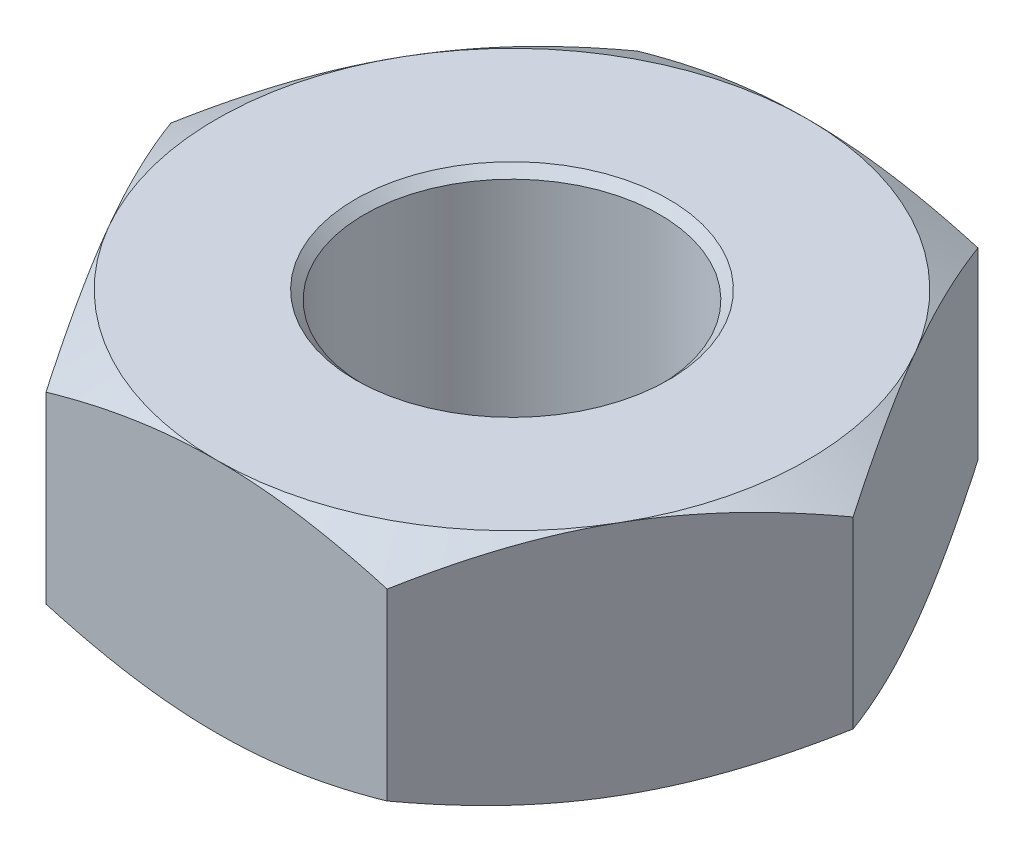
ISO-10303-21;
HEADER;
FILE_DESCRIPTION(('STEP AP214'),'2;1');
FILE_NAME('part.step','',(''),(''),'','','');
FILE_SCHEMA(('AUTOMOTIVE_DESIGN { 1 0 10303 214 1 1 1 1 }'));
ENDSEC;
DATA;
#1=APPLICATION_CONTEXT('core data for automotive mechanical design processes');
#2=APPLICATION_PROTOCOL_DEFINITION('international standard','automotive_design',2000,#1);
#3=PRODUCT_CONTEXT('',#1,'mechanical');
#4=PRODUCT('Part','Part','',(#3));
#5=PRODUCT_RELATED_PRODUCT_CATEGORY('part','',(#4));
#6=PRODUCT_DEFINITION_FORMATION('','',#4);
#7=PRODUCT_DEFINITION_CONTEXT('part definition',#1,'design');
#8=PRODUCT_DEFINITION('design','',#6,#7);
#9=PRODUCT_DEFINITION_SHAPE('','',#8);
#10=(LENGTH_UNIT() NAMED_UNIT(*) SI_UNIT(.MILLI.,.METRE.));
#11=(NAMED_UNIT(*) PLANE_ANGLE_UNIT() SI_UNIT($,.RADIAN.));
#12=(NAMED_UNIT(*) SI_UNIT($,.STERADIAN.) SOLID_ANGLE_UNIT());
#13=UNCERTAINTY_MEASURE_WITH_UNIT(LENGTH_MEASURE(1.E-05),#10,'distance_accuracy_value','');
#14=(GEOMETRIC_REPRESENTATION_CONTEXT(3) GLOBAL_UNCERTAINTY_ASSIGNED_CONTEXT((#13)) GLOBAL_UNIT_ASSIGNED_CONTEXT((#10,
#11,#12)) REPRESENTATION_CONTEXT('',''));
#15=CARTESIAN_POINT('',(0.,0.,0.));
#16=DIRECTION('',(0.,0.,1.));
#17=DIRECTION('',(1.,0.,0.));
#18=AXIS2_PLACEMENT_3D('',#15,#16,#17);
#19=CARTESIAN_POINT('',(0.,2.,0.));
#20=DIRECTION('',(0.,1.,0.));
#21=DIRECTION('',(0.,0.,1.));
#22=AXIS2_PLACEMENT_3D('',#19,#20,#21);
#23=PLANE('',#22);
#24=CARTESIAN_POINT('',(0.,2.,0.));
#25=DIRECTION('',(0.,1.,0.));
#26=DIRECTION('',(0.,0.,1.));
#27=AXIS2_PLACEMENT_3D('',#24,#25,#26);
#28=CIRCLE('',#27,1.325);
#29=CARTESIAN_POINT('',(0.,2.,1.325));
#30=VERTEX_POINT('',#29);
#31=EDGE_CURVE('E12',#30,#30,#28,.F.);
#32=ORIENTED_EDGE('',*,*,#31,.T.);
#33=EDGE_LOOP('',(#32));
#34=FACE_BOUND('',#33,.T.);
#35=CARTESIAN_POINT('',(0.,2.,0.));
#36=DIRECTION('',(0.,1.,0.));
#37=DIRECTION('',(0.,0.,1.));
#38=AXIS2_PLACEMENT_3D('',#35,#36,#37);
#39=CIRCLE('',#38,2.5);
#40=CARTESIAN_POINT('',(-2.1650635094611,2.,1.25));
#41=VERTEX_POINT('',#40);
#42=CARTESIAN_POINT('',(0.,2.,2.5));
#43=VERTEX_POINT('',#42);
#44=EDGE_CURVE('E158',#41,#43,#39,.T.);
#45=ORIENTED_EDGE('',*,*,#44,.T.);
#46=CARTESIAN_POINT('',(2.1650635094611,2.,1.25));
#47=VERTEX_POINT('',#46);
#48=EDGE_CURVE('E139',#43,#47,#39,.T.);
#49=ORIENTED_EDGE('',*,*,#48,.T.);
#50=CARTESIAN_POINT('',(2.1650635094611,2.,-1.25));
#51=VERTEX_POINT('',#50);
#52=EDGE_CURVE('E129',#47,#51,#39,.T.);
#53=ORIENTED_EDGE('',*,*,#52,.T.);
#54=CARTESIAN_POINT('',(0.,2.,-2.5));
#55=VERTEX_POINT('',#54);
#56=EDGE_CURVE('E55',#51,#55,#39,.T.);
#57=ORIENTED_EDGE('',*,*,#56,.T.);
#58=CARTESIAN_POINT('',(-2.1650635094611,2.,-1.25));
#59=VERTEX_POINT('',#58);
#60=EDGE_CURVE('E63',#55,#59,#39,.T.);
#61=ORIENTED_EDGE('',*,*,#60,.T.);
#62=EDGE_CURVE('E162',#59,#41,#39,.T.);
#63=ORIENTED_EDGE('',*,*,#62,.T.);
#64=EDGE_LOOP('',(#45,#49,#53,#57,#61,#63));
#65=FACE_BOUND('',#64,.T.);
#66=ADVANCED_FACE('F39',(#34,#65),#23,.T.);
#67=CARTESIAN_POINT('',(1.44337567297406,2.,2.5));
#68=DIRECTION('',(-0.866025403784439,0.,-0.5));
#69=DIRECTION('',(-0.5,0.,0.866025403784439));
#70=AXIS2_PLACEMENT_3D('',#67,#68,#69);
#71=PLANE('',#70);
#72=CARTESIAN_POINT('',(1.44326020292023,1.77664233564089,2.5002));
#73=CARTESIAN_POINT('',(1.50668977106845,1.81327837989237,2.39033676526513));
#74=CARTESIAN_POINT('',(1.57066685804385,1.84659778103494,2.27952520010348));
#75=CARTESIAN_POINT('',(1.69972891130041,1.90475771444214,2.05598316653395));
#76=CARTESIAN_POINT('',(1.7648161711947,1.92957767085226,1.94324872547161));
#77=CARTESIAN_POINT('',(1.8941840386774,1.96821434855895,1.71917700612473));
#78=CARTESIAN_POINT('',(1.95844473900197,1.98228820381436,1.60787420823262));
#79=CARTESIAN_POINT('',(2.08726857876804,1.99909084764725,1.38474477253167));
#80=CARTESIAN_POINT('',(2.15183124982667,2.00183354879637,1.27291894598577));
#81=CARTESIAN_POINT('',(2.27247489412634,1.99613423999195,1.06395802444848));
#82=CARTESIAN_POINT('',(2.32857390783979,1.98909160561814,0.96679168244227));
#83=CARTESIAN_POINT('',(2.44040644260542,1.96676858087506,0.773092050288998));
#84=CARTESIAN_POINT('',(2.49613957671839,1.95148056155973,0.676559430340268));
#85=CARTESIAN_POINT('',(2.60820277442169,1.91326090615558,0.482460278259524));
#86=CARTESIAN_POINT('',(2.66451865130903,1.89016722387448,0.38491831821786));
#87=CARTESIAN_POINT('',(2.77631036402774,1.83775334342209,0.191289391923915));
#88=CARTESIAN_POINT('',(2.83178763258718,1.80844546437545,0.0951999441138239));
#89=CARTESIAN_POINT('',(2.88686681600197,1.77664233564089,-0.000200000000000342));
#90=B_SPLINE_CURVE_WITH_KNOTS('',3,(#72,#73,#74,#75,#76,#77,#78,#79,#80,#81,#82,#83,#84,#85,#86,
#87,#88,#89),.UNSPECIFIED.,.F.,.F.,(4,2,2,2,2,2,2,2,4),(0.,0.396285827362227,0.793524330152051,
1.18093086852114,1.56786160134475,1.90479741793733,2.24204551660463,2.58677531536756,
2.93082800105257),.UNSPECIFIED.);
#91=CARTESIAN_POINT('',(1.44337567297407,1.7767090063074,2.5));
#92=VERTEX_POINT('',#91);
#93=EDGE_CURVE('E144',#92,#47,#90,.T.);
#94=ORIENTED_EDGE('',*,*,#93,.F.);
#95=DIRECTION('',(0.,-1.,0.));
#96=VECTOR('',#95,1.);
#97=CARTESIAN_POINT('',(1.44337567297406,2.,2.5));
#98=LINE('',#97,#96);
#99=CARTESIAN_POINT('',(1.44337567297406,0.223290993692602,2.5));
#100=VERTEX_POINT('',#99);
#101=EDGE_CURVE('E355',#92,#100,#98,.T.);
#102=ORIENTED_EDGE('',*,*,#101,.T.);
#103=CARTESIAN_POINT('',(1.44326020292023,0.223357664359108,2.5002));
#104=CARTESIAN_POINT('',(1.50668977106845,0.186721620107626,2.39033676526513));
#105=CARTESIAN_POINT('',(1.57066685804385,0.153402218965056,2.27952520010348));
#106=CARTESIAN_POINT('',(1.69972891130041,0.0952422855578578,2.05598316653395));
#107=CARTESIAN_POINT('',(1.7648161711947,0.0704223291477385,1.94324872547161));
#108=CARTESIAN_POINT('',(1.8941840386774,0.0317856514410522,1.71917700612473));
#109=CARTESIAN_POINT('',(1.95844473900197,0.017711796185639,1.60787420823262));
#110=CARTESIAN_POINT('',(2.08726857876804,0.000909152352750122,1.38474477253167));
#111=CARTESIAN_POINT('',(2.15183124982667,-0.00183354879637351,1.27291894598577));
#112=CARTESIAN_POINT('',(2.27247489412634,0.00386576000805331,1.06395802444848));
#113=CARTESIAN_POINT('',(2.32857390783979,0.0109083943818614,0.96679168244227));
#114=CARTESIAN_POINT('',(2.44040644260542,0.0332314191249421,0.773092050288998));
#115=CARTESIAN_POINT('',(2.4961395767184,0.0485194384402666,0.676559430340268));
#116=CARTESIAN_POINT('',(2.60820277442169,0.0867390938444198,0.482460278259524));
#117=CARTESIAN_POINT('',(2.66451865130903,0.109832776125517,0.384918318217859));
#118=CARTESIAN_POINT('',(2.77631036402774,0.162246656577913,0.191289391923915));
#119=CARTESIAN_POINT('',(2.83178763258717,0.191554535624548,0.0951999441138238));
#120=CARTESIAN_POINT('',(2.88686681600197,0.223357664359107,-0.000200000000000347));
#121=B_SPLINE_CURVE_WITH_KNOTS('',3,(#103,#104,#105,#106,#107,#108,#109,#110,#111,#112,#113,
#114,#115,#116,#117,#118,#119,#120),.UNSPECIFIED.,.F.,.F.,(4,2,2,2,2,2,2,2,4),(0.,
0.396285827362227,0.793524330152051,1.18093086852114,1.56786160134475,1.90479741793733,
2.24204551660463,2.58677531536756,2.93082800105257),.UNSPECIFIED.);
#122=CARTESIAN_POINT('',(2.1650635094611,0.,1.25));
#123=VERTEX_POINT('',#122);
#124=EDGE_CURVE('E329',#100,#123,#121,.T.);
#125=ORIENTED_EDGE('',*,*,#124,.T.);
#126=CARTESIAN_POINT('',(2.88675134594813,0.223290993692601,0.));
#127=VERTEX_POINT('',#126);
#128=EDGE_CURVE('E354',#123,#127,#121,.T.);
#129=ORIENTED_EDGE('',*,*,#128,.T.);
#130=DIRECTION('',(0.,-1.,0.));
#131=VECTOR('',#130,1.);
#132=CARTESIAN_POINT('',(2.88675134594813,2.,0.));
#133=LINE('',#132,#131);
#134=CARTESIAN_POINT('',(2.88675134594813,1.7767090063074,0.));
#135=VERTEX_POINT('',#134);
#136=EDGE_CURVE('E155',#135,#127,#133,.T.);
#137=ORIENTED_EDGE('',*,*,#136,.F.);
#138=EDGE_CURVE('E133',#47,#135,#90,.T.);
#139=ORIENTED_EDGE('',*,*,#138,.F.);
#140=EDGE_LOOP('',(#94,#102,#125,#129,#137,#139));
#141=FACE_BOUND('',#140,.T.);
#142=ADVANCED_FACE('F153',(#141),#71,.F.);
#143=CARTESIAN_POINT('',(2.88675134594813,2.,0.));
#144=DIRECTION('',(-0.866025403784438,0.,0.5));
#145=DIRECTION('',(0.5,0.,0.866025403784439));
#146=AXIS2_PLACEMENT_3D('',#143,#144,#145);
#147=PLANE('',#146);
#148=CARTESIAN_POINT('',(2.88686681600197,1.77664233564089,0.000199999999999626));
#149=CARTESIAN_POINT('',(2.82343724785375,1.81327837989237,-0.109663234734872));
#150=CARTESIAN_POINT('',(2.75946016087834,1.84659778103494,-0.220474799896526));
#151=CARTESIAN_POINT('',(2.63039810762178,1.90475771444214,-0.44401683346605));
#152=CARTESIAN_POINT('',(2.5653108477275,1.92957767085226,-0.556751274528388));
#153=CARTESIAN_POINT('',(2.43594298024479,1.96821434855895,-0.780822993875269));
#154=CARTESIAN_POINT('',(2.37168227992023,1.98228820381436,-0.892125791767377));
#155=CARTESIAN_POINT('',(2.24285844015415,1.99909084764725,-1.11525522746833));
#156=CARTESIAN_POINT('',(2.17829576909553,2.00183354879637,-1.22708105401423));
#157=CARTESIAN_POINT('',(2.05765212479586,1.99613423999195,-1.43604197555152));
#158=CARTESIAN_POINT('',(2.0015531110824,1.98909160561814,-1.53320831755773));
#159=CARTESIAN_POINT('',(1.88972057631678,1.96676858087506,-1.726907949711));
#160=CARTESIAN_POINT('',(1.8339874422038,1.95148056155973,-1.82344056965973));
#161=CARTESIAN_POINT('',(1.7219242445005,1.91326090615558,-2.01753972174048));
#162=CARTESIAN_POINT('',(1.66560836761316,1.89016722387448,-2.11508168178214));
#163=CARTESIAN_POINT('',(1.55381665489446,1.83775334342209,-2.30871060807609));
#164=CARTESIAN_POINT('',(1.49833938633502,1.80844546437545,-2.40480005588618));
#165=CARTESIAN_POINT('',(1.44326020292023,1.77664233564089,-2.5002));
#166=B_SPLINE_CURVE_WITH_KNOTS('',3,(#148,#149,#150,#151,#152,#153,#154,#155,#156,#157,#158,
#159,#160,#161,#162,#163,#164,#165),.UNSPECIFIED.,.F.,.F.,(4,2,2,2,2,2,2,2,4),(0.,
0.396285827362227,0.793524330152051,1.18093086852114,1.56786160134475,1.90479741793733,
2.24204551660463,2.58677531536756,2.93082800105256),.UNSPECIFIED.);
#167=EDGE_CURVE('E135',#135,#51,#166,.T.);
#168=ORIENTED_EDGE('',*,*,#167,.F.);
#169=ORIENTED_EDGE('',*,*,#136,.T.);
#170=CARTESIAN_POINT('',(2.88686681600197,0.223357664359108,0.000199999999999604));
#171=CARTESIAN_POINT('',(2.82343724785375,0.186721620107625,-0.109663234734872));
#172=CARTESIAN_POINT('',(2.75946016087834,0.153402218965055,-0.220474799896526));
#173=CARTESIAN_POINT('',(2.63039810762178,0.0952422855578573,-0.44401683346605));
#174=CARTESIAN_POINT('',(2.5653108477275,0.0704223291477378,-0.556751274528388));
#175=CARTESIAN_POINT('',(2.43594298024479,0.0317856514410515,-0.780822993875269));
#176=CARTESIAN_POINT('',(2.37168227992023,0.0177117961856385,-0.892125791767377));
#177=CARTESIAN_POINT('',(2.24285844015415,0.000909152352749786,-1.11525522746833));
#178=CARTESIAN_POINT('',(2.17829576909552,-0.00183354879637383,-1.22708105401423));
#179=CARTESIAN_POINT('',(2.05765212479586,0.00386576000805312,-1.43604197555152));
#180=CARTESIAN_POINT('',(2.0015531110824,0.0109083943818613,-1.53320831755773));
#181=CARTESIAN_POINT('',(1.88972057631678,0.0332314191249421,-1.726907949711));
#182=CARTESIAN_POINT('',(1.8339874422038,0.0485194384402666,-1.82344056965973));
#183=CARTESIAN_POINT('',(1.7219242445005,0.0867390938444197,-2.01753972174048));
#184=CARTESIAN_POINT('',(1.66560836761316,0.109832776125517,-2.11508168178214));
#185=CARTESIAN_POINT('',(1.55381665489446,0.162246656577913,-2.30871060807609));
#186=CARTESIAN_POINT('',(1.49833938633502,0.191554535624548,-2.40480005588618));
#187=CARTESIAN_POINT('',(1.44326020292023,0.223357664359108,-2.5002));
#188=B_SPLINE_CURVE_WITH_KNOTS('',3,(#170,#171,#172,#173,#174,#175,#176,#177,#178,#179,#180,
#181,#182,#183,#184,#185,#186,#187),.UNSPECIFIED.,.F.,.F.,(4,2,2,2,2,2,2,2,4),(0.,
0.396285827362227,0.793524330152051,1.18093086852114,1.56786160134475,1.90479741793733,
2.24204551660463,2.58677531536756,2.93082800105256),.UNSPECIFIED.);
#189=CARTESIAN_POINT('',(2.1650635094611,0.,-1.25));
#190=VERTEX_POINT('',#189);
#191=EDGE_CURVE('E353',#127,#190,#188,.T.);
#192=ORIENTED_EDGE('',*,*,#191,.T.);
#193=CARTESIAN_POINT('',(1.44337567297406,0.223290993692601,-2.5));
#194=VERTEX_POINT('',#193);
#195=EDGE_CURVE('E276',#190,#194,#188,.T.);
#196=ORIENTED_EDGE('',*,*,#195,.T.);
#197=DIRECTION('',(0.,-1.,0.));
#198=VECTOR('',#197,1.);
#199=CARTESIAN_POINT('',(1.44337567297406,2.,-2.5));
#200=LINE('',#199,#198);
#201=CARTESIAN_POINT('',(1.44337567297406,1.7767090063074,-2.5));
#202=VERTEX_POINT('',#201);
#203=EDGE_CURVE('E308',#202,#194,#200,.T.);
#204=ORIENTED_EDGE('',*,*,#203,.F.);
#205=EDGE_CURVE('E294',#51,#202,#166,.T.);
#206=ORIENTED_EDGE('',*,*,#205,.F.);
#207=EDGE_LOOP('',(#168,#169,#192,#196,#204,#206));
#208=FACE_BOUND('',#207,.T.);
#209=ADVANCED_FACE('F286',(#208),#147,.F.);
#210=CARTESIAN_POINT('',(1.44337567297406,2.,-2.5));
#211=DIRECTION('',(0.,0.,1.));
#212=DIRECTION('',(1.,0.,0.));
#213=AXIS2_PLACEMENT_3D('',#210,#211,#212);
#214=PLANE('',#213);
#215=CARTESIAN_POINT('',(4.95546025725831,0.23886913991439,-2.5));
#216=CARTESIAN_POINT('',(4.84013634956431,0.29830705238728,-2.5));
#217=CARTESIAN_POINT('',(4.7246460225252,0.357424850215759,-2.5));
#218=CARTESIAN_POINT('',(4.49325630468262,0.474859183306125,-2.5));
#219=CARTESIAN_POINT('',(4.37735690649526,0.533175704010719,-2.5));
#220=CARTESIAN_POINT('',(4.1448895996528,0.648937601189529,-2.5));
#221=CARTESIAN_POINT('',(4.02832091406309,0.706381420168146,-2.5));
#222=CARTESIAN_POINT('',(3.79460214587849,0.820079970889061,-2.5));
#223=CARTESIAN_POINT('',(3.67745205509282,0.876334685820334,-2.5));
#224=CARTESIAN_POINT('',(3.43623237213589,0.990307336110758,-2.5));
#225=CARTESIAN_POINT('',(3.31212478347623,1.04794507902715,-2.5));
#226=CARTESIAN_POINT('',(3.06296411596909,1.16113738610244,-2.5));
#227=CARTESIAN_POINT('',(2.93791106239758,1.21669200571637,-2.5));
#228=CARTESIAN_POINT('',(2.6867249633323,1.32508022914469,-2.5));
#229=CARTESIAN_POINT('',(2.56059270340477,1.37791564347322,-2.5));
#230=CARTESIAN_POINT('',(2.30688034732466,1.48009338844622,-2.5));
#231=CARTESIAN_POINT('',(2.17929992495435,1.52943491317038,-2.5));
#232=CARTESIAN_POINT('',(1.9021990408897,1.63090693857852,-2.5));
#233=CARTESIAN_POINT('',(1.75238698562144,1.68225330442166,-2.5));
#234=CARTESIAN_POINT('',(1.45013137679933,1.77637300227492,-2.5));
#235=CARTESIAN_POINT('',(1.29768918566677,1.81915063620636,-2.5));
#236=CARTESIAN_POINT('',(0.992861497463515,1.89235207337356,-2.5));
#237=CARTESIAN_POINT('',(0.840531488094672,1.92299800122827,-2.5));
#238=CARTESIAN_POINT('',(0.610429527541454,1.95821132600021,-2.5));
#239=CARTESIAN_POINT('',(0.533468757162743,1.96815605355955,-2.5));
#240=CARTESIAN_POINT('',(0.379148009897454,1.98415216741704,-2.5));
#241=CARTESIAN_POINT('',(0.301788096046695,1.99020415059583,-2.5));
#242=CARTESIAN_POINT('',(0.145769864208737,1.99825419350963,-2.5));
#243=CARTESIAN_POINT('',(0.0671085279944949,2.00019432728128,-2.5));
#244=CARTESIAN_POINT('',(-0.0902023934497374,1.99977488125606,-2.5));
#245=CARTESIAN_POINT('',(-0.168851978685951,1.99741530374438,-2.5));
#246=CARTESIAN_POINT('',(-0.325925509816875,1.9884853187214,-2.5));
#247=CARTESIAN_POINT('',(-0.404349407588461,1.98191407160702,-2.5));
#248=CARTESIAN_POINT('',(-0.560767461798279,1.9648003942496,-2.5));
#249=CARTESIAN_POINT('',(-0.638761545828298,1.95425731446622,-2.5));
#250=CARTESIAN_POINT('',(-0.874995170086807,1.91667702887001,-2.5));
#251=CARTESIAN_POINT('',(-1.03233202614665,1.88388929773098,-2.5));
#252=CARTESIAN_POINT('',(-1.34405006868435,1.806656391876,-2.5));
#253=CARTESIAN_POINT('',(-1.49843027423095,1.76220741779981,-2.5));
#254=CARTESIAN_POINT('',(-1.79947873983941,1.66640445974615,-2.5));
#255=CARTESIAN_POINT('',(-1.94623466968961,1.61532143345771,-2.5));
#256=CARTESIAN_POINT('',(-2.2376148609719,1.50736310066908,-2.5));
#257=CARTESIAN_POINT('',(-2.38223857516911,1.45048633583705,-2.5));
#258=CARTESIAN_POINT('',(-2.66990167292534,1.33244073265682,-2.5));
#259=CARTESIAN_POINT('',(-2.81293906918302,1.27126709002915,-2.5));
#260=CARTESIAN_POINT('',(-3.09760783986213,1.14578759349875,-2.5));
#261=CARTESIAN_POINT('',(-3.23923935866169,1.08148206531973,-2.5));
#262=CARTESIAN_POINT('',(-3.51331387687742,0.954257327411781,-2.5));
#263=CARTESIAN_POINT('',(-3.645818287316,0.891469878016353,-2.5));
#264=CARTESIAN_POINT('',(-3.91003999182487,0.764252431677721,-2.5));
#265=CARTESIAN_POINT('',(-4.04175725926726,0.699822379551611,-2.5));
#266=CARTESIAN_POINT('',(-4.30410826157336,0.569887297724044,-2.5));
#267=CARTESIAN_POINT('',(-4.43474414988587,0.504386605928437,-2.5));
#268=CARTESIAN_POINT('',(-4.69547646945916,0.372347309540981,-2.5));
#269=CARTESIAN_POINT('',(-4.82557294661631,0.305808795646623,-2.5));
#270=CARTESIAN_POINT('',(-4.95546025725831,0.238869139914389,-2.5));
#271=B_SPLINE_CURVE_WITH_KNOTS('',3,(#215,#216,#217,#218,#219,#220,#221,#222,#223,#224,#225,
#226,#227,#228,#229,#230,#231,#232,#233,#234,#235,#236,#237,#238,#239,#240,#241,#242,#243,#244,
#245,#246,#247,#248,#249,#250,#251,#252,#253,#254,#255,#256,#257,#258,#259,#260,#261,#262,#263,
#264,#265,#266,#267,#268,#269,#270),.UNSPECIFIED.,.F.,.F.,(4,2,2,2,2,2,2,2,2,2,2,2,2,2,2,2,2,2,
2,2,2,2,2,2,2,2,2,4),(0.,0.389221413384381,0.778449888667861,1.16830641502868,1.55816844932672,
1.96866920836475,2.37915903165083,2.78937190763566,3.19967909946871,3.6745910225357,
4.14926391574452,4.61479203298068,4.84750996458758,5.08019220467562,5.31613116125285,
5.55206999243419,5.78805587303563,6.02408036275044,6.50556904732277,6.98721480140642,
7.45322695736615,7.91935670364949,8.38601618419368,8.85262723422594,9.29249658309809,
9.73238072881565,10.1707872746418,10.6091557194991),.UNSPECIFIED.);
#272=EDGE_CURVE('E299',#202,#55,#271,.T.);
#273=ORIENTED_EDGE('',*,*,#272,.F.);
#274=ORIENTED_EDGE('',*,*,#203,.T.);
#275=CARTESIAN_POINT('',(4.95546025725831,1.76113086008561,-2.5));
#276=CARTESIAN_POINT('',(4.84013634956431,1.70169294761272,-2.5));
#277=CARTESIAN_POINT('',(4.7246460225252,1.64257514978424,-2.5));
#278=CARTESIAN_POINT('',(4.49325630468262,1.52514081669387,-2.5));
#279=CARTESIAN_POINT('',(4.37735690649526,1.46682429598928,-2.5));
#280=CARTESIAN_POINT('',(4.1448895996528,1.35106239881047,-2.5));
#281=CARTESIAN_POINT('',(4.02832091406309,1.29361857983185,-2.5));
#282=CARTESIAN_POINT('',(3.79460214587849,1.17992002911094,-2.5));
#283=CARTESIAN_POINT('',(3.67745205509282,1.12366531417967,-2.5));
#284=CARTESIAN_POINT('',(3.43623237213589,1.00969266388924,-2.5));
#285=CARTESIAN_POINT('',(3.31212478347623,0.952054920972848,-2.5));
#286=CARTESIAN_POINT('',(3.06296411596909,0.838862613897562,-2.5));
#287=CARTESIAN_POINT('',(2.93791106239758,0.783307994283633,-2.5));
#288=CARTESIAN_POINT('',(2.6867249633323,0.674919770855314,-2.5));
#289=CARTESIAN_POINT('',(2.56059270340477,0.622084356526781,-2.5));
#290=CARTESIAN_POINT('',(2.30688034732466,0.519906611553779,-2.5));
#291=CARTESIAN_POINT('',(2.17929992495435,0.470565086829621,-2.5));
#292=CARTESIAN_POINT('',(1.9021990408897,0.369093061421475,-2.5));
#293=CARTESIAN_POINT('',(1.75238698562144,0.317746695578339,-2.5));
#294=CARTESIAN_POINT('',(1.45013137679933,0.223626997725085,-2.5));
#295=CARTESIAN_POINT('',(1.29768918566677,0.180849363793643,-2.5));
#296=CARTESIAN_POINT('',(0.992861497463515,0.107647926626441,-2.5));
#297=CARTESIAN_POINT('',(0.840531488094672,0.0770019987717323,-2.5));
#298=CARTESIAN_POINT('',(0.610429527541454,0.0417886739997929,-2.5));
#299=CARTESIAN_POINT('',(0.533468757162743,0.0318439464404498,-2.5));
#300=CARTESIAN_POINT('',(0.379148009897454,0.0158478325829567,-2.5));
#301=CARTESIAN_POINT('',(0.301788096046695,0.00979584940417427,-2.5));
#302=CARTESIAN_POINT('',(0.145769864208737,0.00174580649037312,-2.5));
#303=CARTESIAN_POINT('',(0.0671085279944949,-0.00019432728128407,-2.5));
#304=CARTESIAN_POINT('',(-0.0902023934497374,0.000225118743936044,-2.5));
#305=CARTESIAN_POINT('',(-0.168851978685951,0.00258469625561955,-2.5));
#306=CARTESIAN_POINT('',(-0.325925509816875,0.0115146812785994,-2.5));
#307=CARTESIAN_POINT('',(-0.404349407588461,0.0180859283929842,-2.5));
#308=CARTESIAN_POINT('',(-0.560767461798279,0.0351996057504029,-2.5));
#309=CARTESIAN_POINT('',(-0.638761545828298,0.0457426855337832,-2.5));
#310=CARTESIAN_POINT('',(-0.874995170086807,0.0833229711299856,-2.5));
#311=CARTESIAN_POINT('',(-1.03233202614665,0.116110702269018,-2.5));
#312=CARTESIAN_POINT('',(-1.34405006868435,0.193343608123998,-2.5));
#313=CARTESIAN_POINT('',(-1.49843027423095,0.237792582200193,-2.5));
#314=CARTESIAN_POINT('',(-1.79947873983941,0.333595540253851,-2.5));
#315=CARTESIAN_POINT('',(-1.94623466968961,0.384678566542293,-2.5));
#316=CARTESIAN_POINT('',(-2.2376148609719,0.492636899330915,-2.5));
#317=CARTESIAN_POINT('',(-2.38223857516911,0.549513664162951,-2.5));
#318=CARTESIAN_POINT('',(-2.66990167292534,0.667559267343185,-2.5));
#319=CARTESIAN_POINT('',(-2.81293906918302,0.728732909970851,-2.5));
#320=CARTESIAN_POINT('',(-3.09760783986213,0.854212406501255,-2.5));
#321=CARTESIAN_POINT('',(-3.23923935866169,0.918517934680265,-2.5));
#322=CARTESIAN_POINT('',(-3.51331387687742,1.04574267258822,-2.5));
#323=CARTESIAN_POINT('',(-3.645818287316,1.10853012198365,-2.5));
#324=CARTESIAN_POINT('',(-3.91003999182487,1.23574756832228,-2.5));
#325=CARTESIAN_POINT('',(-4.04175725926726,1.30017762044839,-2.5));
#326=CARTESIAN_POINT('',(-4.30410826157336,1.43011270227596,-2.5));
#327=CARTESIAN_POINT('',(-4.43474414988586,1.49561339407156,-2.5));
#328=CARTESIAN_POINT('',(-4.69547646945916,1.62765269045902,-2.5));
#329=CARTESIAN_POINT('',(-4.82557294661631,1.69419120435338,-2.5));
#330=CARTESIAN_POINT('',(-4.95546025725831,1.76113086008561,-2.5));
#331=B_SPLINE_CURVE_WITH_KNOTS('',3,(#275,#276,#277,#278,#279,#280,#281,#282,#283,#284,#285,
#286,#287,#288,#289,#290,#291,#292,#293,#294,#295,#296,#297,#298,#299,#300,#301,#302,#303,#304,
#305,#306,#307,#308,#309,#310,#311,#312,#313,#314,#315,#316,#317,#318,#319,#320,#321,#322,#323,
#324,#325,#326,#327,#328,#329,#330),.UNSPECIFIED.,.F.,.F.,(4,2,2,2,2,2,2,2,2,2,2,2,2,2,2,2,2,2,
2,2,2,2,2,2,2,2,2,4),(0.,0.389221413384381,0.77844988866786,1.16830641502868,1.55816844932672,
1.96866920836475,2.37915903165083,2.78937190763566,3.19967909946871,3.67459102253569,
4.14926391574452,4.61479203298068,4.84750996458758,5.08019220467562,5.31613116125285,
5.55206999243419,5.78805587303563,6.02408036275044,6.50556904732277,6.98721480140642,
7.45322695736615,7.91935670364949,8.38601618419368,8.85262723422594,9.29249658309809,
9.73238072881565,10.1707872746417,10.6091557194991),.UNSPECIFIED.);
#332=CARTESIAN_POINT('',(0.,0.,-2.5));
#333=VERTEX_POINT('',#332);
#334=EDGE_CURVE('E275',#194,#333,#331,.T.);
#335=ORIENTED_EDGE('',*,*,#334,.T.);
#336=CARTESIAN_POINT('',(-1.44337567297406,0.223290993692602,-2.5));
#337=VERTEX_POINT('',#336);
#338=EDGE_CURVE('E268',#333,#337,#331,.T.);
#339=ORIENTED_EDGE('',*,*,#338,.T.);
#340=DIRECTION('',(0.,-1.,0.));
#341=VECTOR('',#340,1.);
#342=CARTESIAN_POINT('',(-1.44337567297406,2.,-2.5));
#343=LINE('',#342,#341);
#344=CARTESIAN_POINT('',(-1.44337567297406,1.7767090063074,-2.5));
#345=VERTEX_POINT('',#344);
#346=EDGE_CURVE('E303',#345,#337,#343,.T.);
#347=ORIENTED_EDGE('',*,*,#346,.F.);
#348=EDGE_CURVE('E174',#55,#345,#271,.T.);
#349=ORIENTED_EDGE('',*,*,#348,.F.);
#350=EDGE_LOOP('',(#273,#274,#335,#339,#347,#349));
#351=FACE_BOUND('',#350,.T.);
#352=ADVANCED_FACE('F283',(#351),#214,.F.);
#353=CARTESIAN_POINT('',(-1.44337567297406,2.,-2.5));
#354=DIRECTION('',(0.866025403784439,0.,0.5));
#355=DIRECTION('',(0.5,0.,-0.866025403784439));
#356=AXIS2_PLACEMENT_3D('',#353,#354,#355);
#357=PLANE('',#356);
#358=CARTESIAN_POINT('',(-1.44326020292023,1.77664233564089,-2.5002));
#359=CARTESIAN_POINT('',(-1.50668977106845,1.81327837989237,-2.39033676526513));
#360=CARTESIAN_POINT('',(-1.57066685804385,1.84659778103494,-2.27952520010348));
#361=CARTESIAN_POINT('',(-1.69972891130041,1.90475771444214,-2.05598316653395));
#362=CARTESIAN_POINT('',(-1.7648161711947,1.92957767085226,-1.94324872547161));
#363=CARTESIAN_POINT('',(-1.8941840386774,1.96821434855895,-1.71917700612473));
#364=CARTESIAN_POINT('',(-1.95844473900197,1.98228820381436,-1.60787420823262));
#365=CARTESIAN_POINT('',(-2.08726857876804,1.99909084764725,-1.38474477253167));
#366=CARTESIAN_POINT('',(-2.15183124982667,2.00183354879637,-1.27291894598577));
#367=CARTESIAN_POINT('',(-2.27247489412634,1.99613423999195,-1.06395802444848));
#368=CARTESIAN_POINT('',(-2.32857390783979,1.98909160561814,-0.96679168244227));
#369=CARTESIAN_POINT('',(-2.44040644260542,1.96676858087506,-0.773092050288998));
#370=CARTESIAN_POINT('',(-2.4961395767184,1.95148056155973,-0.676559430340268));
#371=CARTESIAN_POINT('',(-2.60820277442169,1.91326090615558,-0.482460278259524));
#372=CARTESIAN_POINT('',(-2.66451865130903,1.89016722387448,-0.384918318217859));
#373=CARTESIAN_POINT('',(-2.77631036402774,1.83775334342209,-0.191289391923914));
#374=CARTESIAN_POINT('',(-2.83178763258718,1.80844546437545,-0.0951999441138235));
#375=CARTESIAN_POINT('',(-2.88686681600197,1.77664233564089,0.000200000000000837));
#376=B_SPLINE_CURVE_WITH_KNOTS('',3,(#358,#359,#360,#361,#362,#363,#364,#365,#366,#367,#368,
#369,#370,#371,#372,#373,#374,#375),.UNSPECIFIED.,.F.,.F.,(4,2,2,2,2,2,2,2,4),(0.,
0.396285827362227,0.793524330152051,1.18093086852114,1.56786160134475,1.90479741793733,
2.24204551660463,2.58677531536756,2.93082800105257),.UNSPECIFIED.);
#377=EDGE_CURVE('E171',#345,#59,#376,.T.);
#378=ORIENTED_EDGE('',*,*,#377,.F.);
#379=ORIENTED_EDGE('',*,*,#346,.T.);
#380=CARTESIAN_POINT('',(-1.44326020292023,0.223357664359109,-2.5002));
#381=CARTESIAN_POINT('',(-1.50668977106845,0.186721620107626,-2.39033676526513));
#382=CARTESIAN_POINT('',(-1.57066685804385,0.153402218965057,-2.27952520010348));
#383=CARTESIAN_POINT('',(-1.69972891130041,0.0952422855578583,-2.05598316653395));
#384=CARTESIAN_POINT('',(-1.7648161711947,0.0704223291477388,-1.94324872547161));
#385=CARTESIAN_POINT('',(-1.8941840386774,0.0317856514410525,-1.71917700612473));
#386=CARTESIAN_POINT('',(-1.95844473900197,0.0177117961856394,-1.60787420823262));
#387=CARTESIAN_POINT('',(-2.08726857876804,0.000909152352750701,-1.38474477253167));
#388=CARTESIAN_POINT('',(-2.15183124982667,-0.00183354879637293,-1.27291894598577));
#389=CARTESIAN_POINT('',(-2.27247489412634,0.00386576000805386,-1.06395802444848));
#390=CARTESIAN_POINT('',(-2.32857390783979,0.0109083943818619,-0.96679168244227));
#391=CARTESIAN_POINT('',(-2.44040644260542,0.0332314191249427,-0.773092050288998));
#392=CARTESIAN_POINT('',(-2.4961395767184,0.0485194384402674,-0.676559430340268));
#393=CARTESIAN_POINT('',(-2.60820277442169,0.0867390938444207,-0.482460278259524));
#394=CARTESIAN_POINT('',(-2.66451865130903,0.109832776125517,-0.384918318217859));
#395=CARTESIAN_POINT('',(-2.77631036402774,0.162246656577913,-0.191289391923914));
#396=CARTESIAN_POINT('',(-2.83178763258718,0.191554535624549,-0.0951999441138233));
#397=CARTESIAN_POINT('',(-2.88686681600197,0.223357664359109,0.000200000000000845));
#398=B_SPLINE_CURVE_WITH_KNOTS('',3,(#380,#381,#382,#383,#384,#385,#386,#387,#388,#389,#390,
#391,#392,#393,#394,#395,#396,#397),.UNSPECIFIED.,.F.,.F.,(4,2,2,2,2,2,2,2,4),(0.,
0.396285827362227,0.793524330152051,1.18093086852114,1.56786160134475,1.90479741793733,
2.24204551660463,2.58677531536756,2.93082800105257),.UNSPECIFIED.);
#399=CARTESIAN_POINT('',(-2.1650635094611,0.,-1.25));
#400=VERTEX_POINT('',#399);
#401=EDGE_CURVE('E267',#337,#400,#398,.T.);
#402=ORIENTED_EDGE('',*,*,#401,.T.);
#403=CARTESIAN_POINT('',(-2.88675134594813,0.223290993692602,0.));
#404=VERTEX_POINT('',#403);
#405=EDGE_CURVE('E261',#400,#404,#398,.T.);
#406=ORIENTED_EDGE('',*,*,#405,.T.);
#407=DIRECTION('',(0.,-1.,0.));
#408=VECTOR('',#407,1.);
#409=CARTESIAN_POINT('',(-2.88675134594813,2.,0.));
#410=LINE('',#409,#408);
#411=CARTESIAN_POINT('',(-2.88675134594813,1.7767090063074,0.));
#412=VERTEX_POINT('',#411);
#413=EDGE_CURVE('E181',#412,#404,#410,.T.);
#414=ORIENTED_EDGE('',*,*,#413,.F.);
#415=EDGE_CURVE('E167',#59,#412,#376,.T.);
#416=ORIENTED_EDGE('',*,*,#415,.F.);
#417=EDGE_LOOP('',(#378,#379,#402,#406,#414,#416));
#418=FACE_BOUND('',#417,.T.);
#419=ADVANCED_FACE('F179',(#418),#357,.F.);
#420=CARTESIAN_POINT('',(-2.88675134594813,2.,0.));
#421=DIRECTION('',(0.866025403784439,0.,-0.5));
#422=DIRECTION('',(-0.5,0.,-0.866025403784439));
#423=AXIS2_PLACEMENT_3D('',#420,#421,#422);
#424=PLANE('',#423);
#425=CARTESIAN_POINT('',(-2.88686681600197,1.77664233564089,-0.00019999999999956));
#426=CARTESIAN_POINT('',(-2.82343724785375,1.81327837989237,0.109663234734871));
#427=CARTESIAN_POINT('',(-2.75946016087834,1.84659778103494,0.220474799896526));
#428=CARTESIAN_POINT('',(-2.63039810762178,1.90475771444214,0.44401683346605));
#429=CARTESIAN_POINT('',(-2.5653108477275,1.92957767085226,0.556751274528389));
#430=CARTESIAN_POINT('',(-2.43594298024479,1.96821434855895,0.780822993875269));
#431=CARTESIAN_POINT('',(-2.37168227992023,1.98228820381436,0.892125791767377));
#432=CARTESIAN_POINT('',(-2.24285844015415,1.99909084764725,1.11525522746833));
#433=CARTESIAN_POINT('',(-2.17829576909553,2.00183354879637,1.22708105401423));
#434=CARTESIAN_POINT('',(-2.05765212479586,1.99613423999195,1.43604197555152));
#435=CARTESIAN_POINT('',(-2.0015531110824,1.98909160561814,1.53320831755773));
#436=CARTESIAN_POINT('',(-1.88972057631678,1.96676858087506,1.726907949711));
#437=CARTESIAN_POINT('',(-1.8339874422038,1.95148056155973,1.82344056965973));
#438=CARTESIAN_POINT('',(-1.7219242445005,1.91326090615558,2.01753972174048));
#439=CARTESIAN_POINT('',(-1.66560836761316,1.89016722387448,2.11508168178214));
#440=CARTESIAN_POINT('',(-1.55381665489446,1.83775334342209,2.30871060807609));
#441=CARTESIAN_POINT('',(-1.49833938633502,1.80844546437545,2.40480005588618));
#442=CARTESIAN_POINT('',(-1.44326020292023,1.77664233564089,2.5002));
#443=B_SPLINE_CURVE_WITH_KNOTS('',3,(#425,#426,#427,#428,#429,#430,#431,#432,#433,#434,#435,
#436,#437,#438,#439,#440,#441,#442),.UNSPECIFIED.,.F.,.F.,(4,2,2,2,2,2,2,2,4),(0.,
0.396285827362227,0.793524330152051,1.18093086852114,1.56786160134475,1.90479741793733,
2.24204551660463,2.58677531536756,2.93082800105256),.UNSPECIFIED.);
#444=EDGE_CURVE('E160',#412,#41,#443,.T.);
#445=ORIENTED_EDGE('',*,*,#444,.F.);
#446=ORIENTED_EDGE('',*,*,#413,.T.);
#447=CARTESIAN_POINT('',(-2.88686681600197,0.223357664359109,-0.000199999999999567));
#448=CARTESIAN_POINT('',(-2.82343724785375,0.186721620107626,0.109663234734872));
#449=CARTESIAN_POINT('',(-2.75946016087834,0.153402218965056,0.220474799896526));
#450=CARTESIAN_POINT('',(-2.63039810762178,0.0952422855578582,0.44401683346605));
#451=CARTESIAN_POINT('',(-2.5653108477275,0.0704223291477388,0.556751274528389));
#452=CARTESIAN_POINT('',(-2.43594298024479,0.0317856514410524,0.780822993875269));
#453=CARTESIAN_POINT('',(-2.37168227992023,0.0177117961856393,0.892125791767377));
#454=CARTESIAN_POINT('',(-2.24285844015415,0.000909152352750693,1.11525522746833));
#455=CARTESIAN_POINT('',(-2.17829576909553,-0.00183354879637275,1.22708105401423));
#456=CARTESIAN_POINT('',(-2.05765212479586,0.00386576000805428,1.43604197555152));
#457=CARTESIAN_POINT('',(-2.0015531110824,0.0109083943818624,1.53320831755773));
#458=CARTESIAN_POINT('',(-1.88972057631678,0.033231419124943,1.726907949711));
#459=CARTESIAN_POINT('',(-1.8339874422038,0.0485194384402674,1.82344056965973));
#460=CARTESIAN_POINT('',(-1.7219242445005,0.0867390938444205,2.01753972174048));
#461=CARTESIAN_POINT('',(-1.66560836761316,0.109832776125517,2.11508168178214));
#462=CARTESIAN_POINT('',(-1.55381665489446,0.162246656577913,2.30871060807609));
#463=CARTESIAN_POINT('',(-1.49833938633502,0.191554535624549,2.40480005588618));
#464=CARTESIAN_POINT('',(-1.44326020292023,0.223357664359108,2.5002));
#465=B_SPLINE_CURVE_WITH_KNOTS('',3,(#447,#448,#449,#450,#451,#452,#453,#454,#455,#456,#457,
#458,#459,#460,#461,#462,#463,#464),.UNSPECIFIED.,.F.,.F.,(4,2,2,2,2,2,2,2,4),(0.,
0.396285827362227,0.793524330152051,1.18093086852114,1.56786160134475,1.90479741793733,
2.24204551660463,2.58677531536756,2.93082800105256),.UNSPECIFIED.);
#466=CARTESIAN_POINT('',(-2.1650635094611,0.,1.25));
#467=VERTEX_POINT('',#466);
#468=EDGE_CURVE('E259',#404,#467,#465,.T.);
#469=ORIENTED_EDGE('',*,*,#468,.T.);
#470=CARTESIAN_POINT('',(-1.44337567297407,0.223290993692601,2.5));
#471=VERTEX_POINT('',#470);
#472=EDGE_CURVE('E252',#467,#471,#465,.T.);
#473=ORIENTED_EDGE('',*,*,#472,.T.);
#474=DIRECTION('',(0.,-1.,0.));
#475=VECTOR('',#474,1.);
#476=CARTESIAN_POINT('',(-1.44337567297407,2.,2.5));
#477=LINE('',#476,#475);
#478=CARTESIAN_POINT('',(-1.44337567297407,1.7767090063074,2.5));
#479=VERTEX_POINT('',#478);
#480=EDGE_CURVE('E311',#479,#471,#477,.T.);
#481=ORIENTED_EDGE('',*,*,#480,.F.);
#482=EDGE_CURVE('E159',#41,#479,#443,.T.);
#483=ORIENTED_EDGE('',*,*,#482,.F.);
#484=EDGE_LOOP('',(#445,#446,#469,#473,#481,#483));
#485=FACE_BOUND('',#484,.T.);
#486=ADVANCED_FACE('F243',(#485),#424,.F.);
#487=CARTESIAN_POINT('',(-1.44337567297407,2.,2.5));
#488=DIRECTION('',(0.,0.,-1.));
#489=DIRECTION('',(-1.,0.,0.));
#490=AXIS2_PLACEMENT_3D('',#487,#488,#489);
#491=PLANE('',#490);
#492=CARTESIAN_POINT('',(-4.95546025725831,0.238869139914389,2.5));
#493=CARTESIAN_POINT('',(-4.84013634956431,0.298307052387279,2.5));
#494=CARTESIAN_POINT('',(-4.7246460225252,0.357424850215758,2.5));
#495=CARTESIAN_POINT('',(-4.49325630468262,0.474859183306123,2.5));
#496=CARTESIAN_POINT('',(-4.37735690649526,0.533175704010718,2.5));
#497=CARTESIAN_POINT('',(-4.1448895996528,0.648937601189527,2.5));
#498=CARTESIAN_POINT('',(-4.0283209140631,0.706381420168145,2.5));
#499=CARTESIAN_POINT('',(-3.79460214587849,0.82007997088906,2.5));
#500=CARTESIAN_POINT('',(-3.67745205509282,0.876334685820333,2.5));
#501=CARTESIAN_POINT('',(-3.4362323721359,0.990307336110757,2.5));
#502=CARTESIAN_POINT('',(-3.31212478347623,1.04794507902715,2.5));
#503=CARTESIAN_POINT('',(-3.06296411596909,1.16113738610244,2.5));
#504=CARTESIAN_POINT('',(-2.93791106239759,1.21669200571637,2.5));
#505=CARTESIAN_POINT('',(-2.68672496333231,1.32508022914468,2.5));
#506=CARTESIAN_POINT('',(-2.56059270340477,1.37791564347322,2.5));
#507=CARTESIAN_POINT('',(-2.30688034732466,1.48009338844622,2.5));
#508=CARTESIAN_POINT('',(-2.17929992495435,1.52943491317038,2.5));
#509=CARTESIAN_POINT('',(-1.9021990408897,1.63090693857852,2.5));
#510=CARTESIAN_POINT('',(-1.75238698562144,1.68225330442166,2.5));
#511=CARTESIAN_POINT('',(-1.45013137679933,1.77637300227492,2.5));
#512=CARTESIAN_POINT('',(-1.29768918566677,1.81915063620636,2.5));
#513=CARTESIAN_POINT('',(-0.992861497463517,1.89235207337356,2.5));
#514=CARTESIAN_POINT('',(-0.840531488094673,1.92299800122827,2.5));
#515=CARTESIAN_POINT('',(-0.610429527541455,1.95821132600021,2.5));
#516=CARTESIAN_POINT('',(-0.533468757162744,1.96815605355955,2.5));
#517=CARTESIAN_POINT('',(-0.379148009897455,1.98415216741704,2.5));
#518=CARTESIAN_POINT('',(-0.301788096046696,1.99020415059583,2.5));
#519=CARTESIAN_POINT('',(-0.145769864208738,1.99825419350963,2.5));
#520=CARTESIAN_POINT('',(-0.0671085279944955,2.00019432728128,2.5));
#521=CARTESIAN_POINT('',(0.0902023934497367,1.99977488125606,2.5));
#522=CARTESIAN_POINT('',(0.16885197868595,1.99741530374438,2.5));
#523=CARTESIAN_POINT('',(0.325925509816874,1.9884853187214,2.5));
#524=CARTESIAN_POINT('',(0.40434940758846,1.98191407160702,2.5));
#525=CARTESIAN_POINT('',(0.560767461798278,1.9648003942496,2.5));
#526=CARTESIAN_POINT('',(0.638761545828297,1.95425731446622,2.5));
#527=CARTESIAN_POINT('',(0.874995170086805,1.91667702887001,2.5));
#528=CARTESIAN_POINT('',(1.03233202614664,1.88388929773098,2.5));
#529=CARTESIAN_POINT('',(1.34405006868435,1.806656391876,2.5));
#530=CARTESIAN_POINT('',(1.49843027423095,1.76220741779981,2.5));
#531=CARTESIAN_POINT('',(1.79947873983941,1.66640445974615,2.5));
#532=CARTESIAN_POINT('',(1.94623466968961,1.61532143345771,2.5));
#533=CARTESIAN_POINT('',(2.2376148609719,1.50736310066908,2.5));
#534=CARTESIAN_POINT('',(2.38223857516911,1.45048633583705,2.5));
#535=CARTESIAN_POINT('',(2.66990167292534,1.33244073265681,2.5));
#536=CARTESIAN_POINT('',(2.81293906918302,1.27126709002915,2.5));
#537=CARTESIAN_POINT('',(3.09760783986213,1.14578759349874,2.5));
#538=CARTESIAN_POINT('',(3.23923935866169,1.08148206531973,2.5));
#539=CARTESIAN_POINT('',(3.51331387687742,0.95425732741178,2.5));
#540=CARTESIAN_POINT('',(3.64581828731601,0.891469878016351,2.5));
#541=CARTESIAN_POINT('',(3.91003999182488,0.764252431677719,2.5));
#542=CARTESIAN_POINT('',(4.04175725926727,0.699822379551608,2.5));
#543=CARTESIAN_POINT('',(4.30410826157337,0.569887297724041,2.5));
#544=CARTESIAN_POINT('',(4.43474414988587,0.504386605928434,2.5));
#545=CARTESIAN_POINT('',(4.69547646945916,0.372347309540979,2.5));
#546=CARTESIAN_POINT('',(4.82557294661631,0.305808795646622,2.5));
#547=CARTESIAN_POINT('',(4.95546025725831,0.238869139914388,2.5));
#548=B_SPLINE_CURVE_WITH_KNOTS('',3,(#492,#493,#494,#495,#496,#497,#498,#499,#500,#501,#502,
#503,#504,#505,#506,#507,#508,#509,#510,#511,#512,#513,#514,#515,#516,#517,#518,#519,#520,#521,
#522,#523,#524,#525,#526,#527,#528,#529,#530,#531,#532,#533,#534,#535,#536,#537,#538,#539,#540,
#541,#542,#543,#544,#545,#546,#547),.UNSPECIFIED.,.F.,.F.,(4,2,2,2,2,2,2,2,2,2,2,2,2,2,2,2,2,2,
2,2,2,2,2,2,2,2,2,4),(0.,0.389221413384381,0.778449888667862,1.16830641502868,1.55816844932672,
1.96866920836475,2.37915903165083,2.78937190763566,3.19967909946871,3.6745910225357,
4.14926391574452,4.61479203298068,4.84750996458758,5.08019220467563,5.31613116125285,
5.5520699924342,5.78805587303564,6.02408036275044,6.50556904732277,6.98721480140643,
7.45322695736616,7.9193567036495,8.38601618419368,8.85262723422595,9.29249658309809,
9.73238072881566,10.1707872746418,10.6091557194991),.UNSPECIFIED.);
#549=EDGE_CURVE('E228',#479,#43,#548,.T.);
#550=ORIENTED_EDGE('',*,*,#549,.F.);
#551=ORIENTED_EDGE('',*,*,#480,.T.);
#552=CARTESIAN_POINT('',(-4.95546025725831,1.76113086008561,2.5));
#553=CARTESIAN_POINT('',(-4.84013634956431,1.70169294761272,2.5));
#554=CARTESIAN_POINT('',(-4.7246460225252,1.64257514978424,2.5));
#555=CARTESIAN_POINT('',(-4.49325630468262,1.52514081669388,2.5));
#556=CARTESIAN_POINT('',(-4.37735690649526,1.46682429598928,2.5));
#557=CARTESIAN_POINT('',(-4.1448895996528,1.35106239881047,2.5));
#558=CARTESIAN_POINT('',(-4.0283209140631,1.29361857983186,2.5));
#559=CARTESIAN_POINT('',(-3.79460214587849,1.17992002911094,2.5));
#560=CARTESIAN_POINT('',(-3.67745205509282,1.12366531417967,2.5));
#561=CARTESIAN_POINT('',(-3.4362323721359,1.00969266388924,2.5));
#562=CARTESIAN_POINT('',(-3.31212478347623,0.952054920972849,2.5));
#563=CARTESIAN_POINT('',(-3.06296411596909,0.838862613897563,2.5));
#564=CARTESIAN_POINT('',(-2.93791106239759,0.783307994283634,2.5));
#565=CARTESIAN_POINT('',(-2.68672496333231,0.674919770855316,2.5));
#566=CARTESIAN_POINT('',(-2.56059270340477,0.622084356526782,2.5));
#567=CARTESIAN_POINT('',(-2.30688034732466,0.519906611553779,2.5));
#568=CARTESIAN_POINT('',(-2.17929992495435,0.470565086829621,2.5));
#569=CARTESIAN_POINT('',(-1.9021990408897,0.369093061421475,2.5));
#570=CARTESIAN_POINT('',(-1.75238698562144,0.317746695578339,2.5));
#571=CARTESIAN_POINT('',(-1.45013137679933,0.223626997725085,2.5));
#572=CARTESIAN_POINT('',(-1.29768918566677,0.180849363793643,2.5));
#573=CARTESIAN_POINT('',(-0.992861497463517,0.107647926626441,2.5));
#574=CARTESIAN_POINT('',(-0.840531488094674,0.0770019987717319,2.5));
#575=CARTESIAN_POINT('',(-0.610429527541455,0.0417886739997925,2.5));
#576=CARTESIAN_POINT('',(-0.533468757162744,0.0318439464404495,2.5));
#577=CARTESIAN_POINT('',(-0.379148009897455,0.0158478325829564,2.5));
#578=CARTESIAN_POINT('',(-0.301788096046696,0.00979584940417397,2.5));
#579=CARTESIAN_POINT('',(-0.145769864208737,0.00174580649037283,2.5));
#580=CARTESIAN_POINT('',(-0.0671085279944956,-0.00019432728128434,2.5));
#581=CARTESIAN_POINT('',(0.0902023934497366,0.000225118743935817,2.5));
#582=CARTESIAN_POINT('',(0.16885197868595,0.00258469625561935,2.5));
#583=CARTESIAN_POINT('',(0.325925509816875,0.0115146812785992,2.5));
#584=CARTESIAN_POINT('',(0.404349407588461,0.018085928392984,2.5));
#585=CARTESIAN_POINT('',(0.56076746179828,0.0351996057504027,2.5));
#586=CARTESIAN_POINT('',(0.638761545828298,0.0457426855337831,2.5));
#587=CARTESIAN_POINT('',(0.874995170086807,0.0833229711299855,2.5));
#588=CARTESIAN_POINT('',(1.03233202614665,0.116110702269018,2.5));
#589=CARTESIAN_POINT('',(1.34405006868435,0.193343608123999,2.5));
#590=CARTESIAN_POINT('',(1.49843027423096,0.237792582200193,2.5));
#591=CARTESIAN_POINT('',(1.79947873983941,0.333595540253852,2.5));
#592=CARTESIAN_POINT('',(1.94623466968961,0.384678566542294,2.5));
#593=CARTESIAN_POINT('',(2.2376148609719,0.492636899330916,2.5));
#594=CARTESIAN_POINT('',(2.38223857516911,0.549513664162951,2.5));
#595=CARTESIAN_POINT('',(2.66990167292534,0.667559267343185,2.5));
#596=CARTESIAN_POINT('',(2.81293906918302,0.728732909970851,2.5));
#597=CARTESIAN_POINT('',(3.09760783986213,0.854212406501255,2.5));
#598=CARTESIAN_POINT('',(3.23923935866169,0.918517934680266,2.5));
#599=CARTESIAN_POINT('',(3.51331387687742,1.04574267258822,2.5));
#600=CARTESIAN_POINT('',(3.64581828731601,1.10853012198365,2.5));
#601=CARTESIAN_POINT('',(3.91003999182488,1.23574756832228,2.5));
#602=CARTESIAN_POINT('',(4.04175725926727,1.30017762044839,2.5));
#603=CARTESIAN_POINT('',(4.30410826157336,1.43011270227596,2.5));
#604=CARTESIAN_POINT('',(4.43474414988587,1.49561339407156,2.5));
#605=CARTESIAN_POINT('',(4.69547646945916,1.62765269045902,2.5));
#606=CARTESIAN_POINT('',(4.82557294661631,1.69419120435338,2.5));
#607=CARTESIAN_POINT('',(4.95546025725831,1.76113086008561,2.5));
#608=B_SPLINE_CURVE_WITH_KNOTS('',3,(#552,#553,#554,#555,#556,#557,#558,#559,#560,#561,#562,
#563,#564,#565,#566,#567,#568,#569,#570,#571,#572,#573,#574,#575,#576,#577,#578,#579,#580,#581,
#582,#583,#584,#585,#586,#587,#588,#589,#590,#591,#592,#593,#594,#595,#596,#597,#598,#599,#600,
#601,#602,#603,#604,#605,#606,#607),.UNSPECIFIED.,.F.,.F.,(4,2,2,2,2,2,2,2,2,2,2,2,2,2,2,2,2,2,
2,2,2,2,2,2,2,2,2,4),(0.,0.38922141338438,0.77844988866786,1.16830641502868,1.55816844932672,
1.96866920836475,2.37915903165083,2.78937190763566,3.19967909946871,3.6745910225357,
4.14926391574452,4.61479203298068,4.84750996458758,5.08019220467563,5.31613116125285,
5.5520699924342,5.78805587303564,6.02408036275044,6.50556904732278,6.98721480140643,
7.45322695736616,7.9193567036495,8.38601618419368,8.85262723422595,9.29249658309809,
9.73238072881566,10.1707872746418,10.6091557194991),.UNSPECIFIED.);
#609=CARTESIAN_POINT('',(0.,0.,2.5));
#610=VERTEX_POINT('',#609);
#611=EDGE_CURVE('E229',#471,#610,#608,.T.);
#612=ORIENTED_EDGE('',*,*,#611,.T.);
#613=EDGE_CURVE('E230',#610,#100,#608,.T.);
#614=ORIENTED_EDGE('',*,*,#613,.T.);
#615=ORIENTED_EDGE('',*,*,#101,.F.);
#616=EDGE_CURVE('E147',#43,#92,#548,.T.);
#617=ORIENTED_EDGE('',*,*,#616,.F.);
#618=EDGE_LOOP('',(#550,#551,#612,#614,#615,#617));
#619=FACE_BOUND('',#618,.T.);
#620=ADVANCED_FACE('F238',(#619),#491,.F.);
#621=CARTESIAN_POINT('',(0.,0.,0.));
#622=DIRECTION('',(0.,1.,0.));
#623=DIRECTION('',(0.,0.,1.));
#624=AXIS2_PLACEMENT_3D('',#621,#622,#623);
#625=PLANE('',#624);
#626=CARTESIAN_POINT('',(0.,0.,0.));
#627=DIRECTION('',(0.,1.,0.));
#628=DIRECTION('',(0.,0.,1.));
#629=AXIS2_PLACEMENT_3D('',#626,#627,#628);
#630=CIRCLE('',#629,1.325);
#631=CARTESIAN_POINT('',(0.,0.,1.325));
#632=VERTEX_POINT('',#631);
#633=EDGE_CURVE('E236',#632,#632,#630,.T.);
#634=ORIENTED_EDGE('',*,*,#633,.T.);
#635=EDGE_LOOP('',(#634));
#636=FACE_BOUND('',#635,.T.);
#637=CARTESIAN_POINT('',(0.,0.,0.));
#638=DIRECTION('',(0.,1.,0.));
#639=DIRECTION('',(0.,0.,1.));
#640=AXIS2_PLACEMENT_3D('',#637,#638,#639);
#641=CIRCLE('',#640,2.5);
#642=EDGE_CURVE('E260',#610,#123,#641,.T.);
#643=ORIENTED_EDGE('',*,*,#642,.F.);
#644=EDGE_CURVE('E150',#467,#610,#641,.T.);
#645=ORIENTED_EDGE('',*,*,#644,.F.);
#646=EDGE_CURVE('E335',#400,#467,#641,.T.);
#647=ORIENTED_EDGE('',*,*,#646,.F.);
#648=EDGE_CURVE('E342',#333,#400,#641,.T.);
#649=ORIENTED_EDGE('',*,*,#648,.F.);
#650=EDGE_CURVE('E339',#190,#333,#641,.T.);
#651=ORIENTED_EDGE('',*,*,#650,.F.);
#652=EDGE_CURVE('E338',#123,#190,#641,.T.);
#653=ORIENTED_EDGE('',*,*,#652,.F.);
#654=EDGE_LOOP('',(#643,#645,#647,#649,#651,#653));
#655=FACE_BOUND('',#654,.T.);
#656=ADVANCED_FACE('F242',(#636,#655),#625,.F.);
#657=CARTESIAN_POINT('',(0.,2.,0.));
#658=DIRECTION('',(0.,-1.,0.));
#659=DIRECTION('',(0.,0.,-1.));
#660=AXIS2_PLACEMENT_3D('',#657,#658,#659);
#661=CYLINDRICAL_SURFACE('',#660,1.25);
#662=CARTESIAN_POINT('',(0.,0.0750000000000006,0.));
#663=DIRECTION('',(0.,1.,0.));
#664=DIRECTION('',(0.,0.,1.));
#665=AXIS2_PLACEMENT_3D('',#662,#663,#664);
#666=CIRCLE('',#665,1.25);
#667=CARTESIAN_POINT('',(0.,0.0750000000000006,1.25));
#668=VERTEX_POINT('',#667);
#669=EDGE_CURVE('E48',#668,#668,#666,.F.);
#670=ORIENTED_EDGE('',*,*,#669,.T.);
#671=EDGE_LOOP('',(#670));
#672=FACE_BOUND('',#671,.T.);
#673=CARTESIAN_POINT('',(0.,1.925,0.));
#674=DIRECTION('',(0.,1.,0.));
#675=DIRECTION('',(0.,0.,1.));
#676=AXIS2_PLACEMENT_3D('',#673,#674,#675);
#677=CIRCLE('',#676,1.25);
#678=CARTESIAN_POINT('',(0.,1.925,1.25));
#679=VERTEX_POINT('',#678);
#680=EDGE_CURVE('E384',#679,#679,#677,.T.);
#681=ORIENTED_EDGE('',*,*,#680,.T.);
#682=EDGE_LOOP('',(#681));
#683=FACE_BOUND('',#682,.T.);
#684=ADVANCED_FACE('F371',(#672,#683),#661,.F.);
#685=CARTESIAN_POINT('',(0.,0.,0.));
#686=DIRECTION('',(0.,1.,0.));
#687=DIRECTION('',(0.,0.,1.));
#688=AXIS2_PLACEMENT_3D('',#685,#686,#687);
#689=CONICAL_SURFACE('',#688,2.5,1.0471975511966);
#690=ORIENTED_EDGE('',*,*,#613,.F.);
#691=ORIENTED_EDGE('',*,*,#642,.T.);
#692=ORIENTED_EDGE('',*,*,#124,.F.);
#693=EDGE_LOOP('',(#690,#691,#692));
#694=FACE_BOUND('',#693,.T.);
#695=ADVANCED_FACE('F206',(#694),#689,.T.);
#696=ORIENTED_EDGE('',*,*,#644,.T.);
#697=ORIENTED_EDGE('',*,*,#611,.F.);
#698=ORIENTED_EDGE('',*,*,#472,.F.);
#699=EDGE_LOOP('',(#696,#697,#698));
#700=FACE_BOUND('',#699,.T.);
#701=ADVANCED_FACE('F331',(#700),#689,.T.);
#702=ORIENTED_EDGE('',*,*,#646,.T.);
#703=ORIENTED_EDGE('',*,*,#468,.F.);
#704=ORIENTED_EDGE('',*,*,#405,.F.);
#705=EDGE_LOOP('',(#702,#703,#704));
#706=FACE_BOUND('',#705,.T.);
#707=ADVANCED_FACE('F350',(#706),#689,.T.);
#708=ORIENTED_EDGE('',*,*,#648,.T.);
#709=ORIENTED_EDGE('',*,*,#401,.F.);
#710=ORIENTED_EDGE('',*,*,#338,.F.);
#711=EDGE_LOOP('',(#708,#709,#710));
#712=FACE_BOUND('',#711,.T.);
#713=ADVANCED_FACE('F351',(#712),#689,.T.);
#714=ORIENTED_EDGE('',*,*,#650,.T.);
#715=ORIENTED_EDGE('',*,*,#334,.F.);
#716=ORIENTED_EDGE('',*,*,#195,.F.);
#717=EDGE_LOOP('',(#714,#715,#716));
#718=FACE_BOUND('',#717,.T.);
#719=ADVANCED_FACE('F471',(#718),#689,.T.);
#720=ORIENTED_EDGE('',*,*,#652,.T.);
#721=ORIENTED_EDGE('',*,*,#191,.F.);
#722=ORIENTED_EDGE('',*,*,#128,.F.);
#723=EDGE_LOOP('',(#720,#721,#722));
#724=FACE_BOUND('',#723,.T.);
#725=ADVANCED_FACE('F205',(#724),#689,.T.);
#726=CARTESIAN_POINT('',(0.,2.,0.));
#727=DIRECTION('',(0.,-1.,0.));
#728=DIRECTION('',(0.,0.,1.));
#729=AXIS2_PLACEMENT_3D('',#726,#727,#728);
#730=CONICAL_SURFACE('',#729,2.5,1.0471975511966);
#731=ORIENTED_EDGE('',*,*,#93,.T.);
#732=ORIENTED_EDGE('',*,*,#48,.F.);
#733=ORIENTED_EDGE('',*,*,#616,.T.);
#734=EDGE_LOOP('',(#731,#732,#733));
#735=FACE_BOUND('',#734,.T.);
#736=ADVANCED_FACE('F145',(#735),#730,.T.);
#737=ORIENTED_EDGE('',*,*,#482,.T.);
#738=ORIENTED_EDGE('',*,*,#549,.T.);
#739=ORIENTED_EDGE('',*,*,#44,.F.);
#740=EDGE_LOOP('',(#737,#738,#739));
#741=FACE_BOUND('',#740,.T.);
#742=ADVANCED_FACE('F204',(#741),#730,.T.);
#743=ORIENTED_EDGE('',*,*,#415,.T.);
#744=ORIENTED_EDGE('',*,*,#444,.T.);
#745=ORIENTED_EDGE('',*,*,#62,.F.);
#746=EDGE_LOOP('',(#743,#744,#745));
#747=FACE_BOUND('',#746,.T.);
#748=ADVANCED_FACE('F165',(#747),#730,.T.);
#749=ORIENTED_EDGE('',*,*,#348,.T.);
#750=ORIENTED_EDGE('',*,*,#377,.T.);
#751=ORIENTED_EDGE('',*,*,#60,.F.);
#752=EDGE_LOOP('',(#749,#750,#751));
#753=FACE_BOUND('',#752,.T.);
#754=ADVANCED_FACE('F172',(#753),#730,.T.);
#755=ORIENTED_EDGE('',*,*,#205,.T.);
#756=ORIENTED_EDGE('',*,*,#272,.T.);
#757=ORIENTED_EDGE('',*,*,#56,.F.);
#758=EDGE_LOOP('',(#755,#756,#757));
#759=FACE_BOUND('',#758,.T.);
#760=ADVANCED_FACE('F301',(#759),#730,.T.);
#761=ORIENTED_EDGE('',*,*,#138,.T.);
#762=ORIENTED_EDGE('',*,*,#167,.T.);
#763=ORIENTED_EDGE('',*,*,#52,.F.);
#764=EDGE_LOOP('',(#761,#762,#763));
#765=FACE_BOUND('',#764,.T.);
#766=ADVANCED_FACE('F131',(#765),#730,.T.);
#767=CARTESIAN_POINT('',(0.,0.,0.));
#768=DIRECTION('',(0.,-1.,0.));
#769=DIRECTION('',(0.,0.,-1.));
#770=AXIS2_PLACEMENT_3D('',#767,#768,#769);
#771=CONICAL_SURFACE('',#770,1.325,0.785398163397443);
#772=ORIENTED_EDGE('',*,*,#669,.F.);
#773=EDGE_LOOP('',(#772));
#774=FACE_BOUND('',#773,.T.);
#775=ORIENTED_EDGE('',*,*,#633,.F.);
#776=EDGE_LOOP('',(#775));
#777=FACE_BOUND('',#776,.T.);
#778=ADVANCED_FACE('F389',(#774,#777),#771,.F.);
#779=CARTESIAN_POINT('',(0.,1.925,0.));
#780=DIRECTION('',(0.,1.,0.));
#781=DIRECTION('',(0.,0.,1.));
#782=AXIS2_PLACEMENT_3D('',#779,#780,#781);
#783=CONICAL_SURFACE('',#782,1.25,0.78539816339745);
#784=ORIENTED_EDGE('',*,*,#31,.F.);
#785=EDGE_LOOP('',(#784));
#786=FACE_BOUND('',#785,.T.);
#787=ORIENTED_EDGE('',*,*,#680,.F.);
#788=EDGE_LOOP('',(#787));
#789=FACE_BOUND('',#788,.T.);
#790=ADVANCED_FACE('F42',(#786,#789),#783,.F.);
#791=CLOSED_SHELL('',(#66,#142,#209,#352,#419,#486,#620,#656,#684,#695,#701,#707,#713,#719,#725,
#736,#742,#748,#754,#760,#766,#778,#790));
#792=MANIFOLD_SOLID_BREP('B2',#791);
#793=ADVANCED_BREP_SHAPE_REPRESENTATION('',(#18,#792),#14);
#794=SHAPE_DEFINITION_REPRESENTATION(#9,#793);
ENDSEC;
END-ISO-10303-21;
